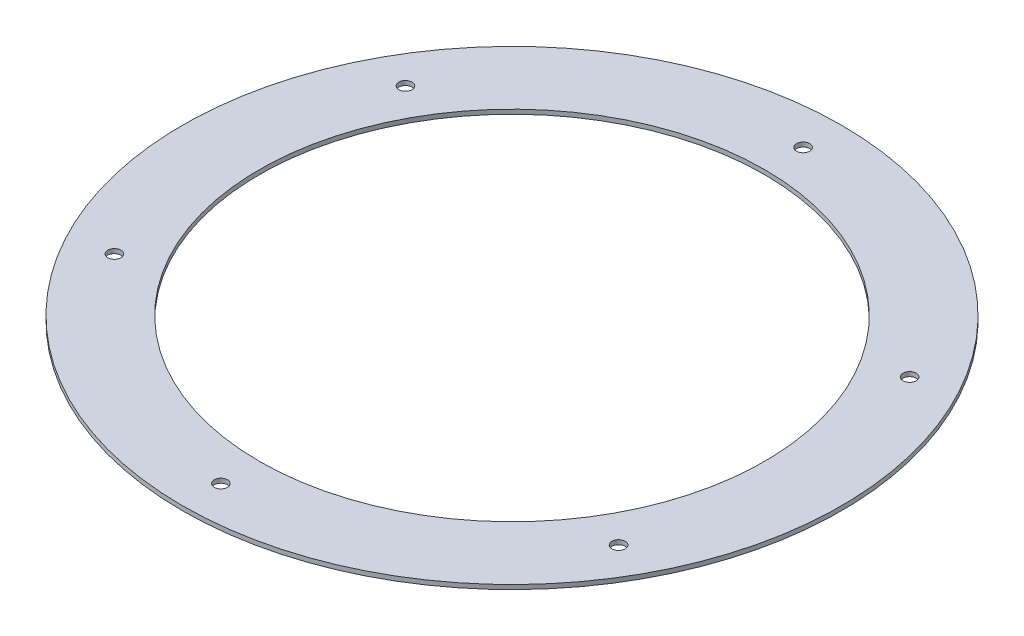
ISO-10303-21;
HEADER;
FILE_DESCRIPTION(('STEP AP214'),'2;1');
FILE_NAME('part.step','',(''),(''),'','','');
FILE_SCHEMA(('AUTOMOTIVE_DESIGN { 1 0 10303 214 1 1 1 1 }'));
ENDSEC;
DATA;
#1=APPLICATION_CONTEXT('core data for automotive mechanical design processes');
#2=APPLICATION_PROTOCOL_DEFINITION('international standard','automotive_design',2000,#1);
#3=PRODUCT_CONTEXT('',#1,'mechanical');
#4=PRODUCT('Part','Part','',(#3));
#5=PRODUCT_RELATED_PRODUCT_CATEGORY('part','',(#4));
#6=PRODUCT_DEFINITION_FORMATION('','',#4);
#7=PRODUCT_DEFINITION_CONTEXT('part definition',#1,'design');
#8=PRODUCT_DEFINITION('design','',#6,#7);
#9=PRODUCT_DEFINITION_SHAPE('','',#8);
#10=(LENGTH_UNIT() NAMED_UNIT(*) SI_UNIT(.MILLI.,.METRE.));
#11=(NAMED_UNIT(*) PLANE_ANGLE_UNIT() SI_UNIT($,.RADIAN.));
#12=(NAMED_UNIT(*) SI_UNIT($,.STERADIAN.) SOLID_ANGLE_UNIT());
#13=UNCERTAINTY_MEASURE_WITH_UNIT(LENGTH_MEASURE(1.E-05),#10,'distance_accuracy_value','');
#14=(GEOMETRIC_REPRESENTATION_CONTEXT(3) GLOBAL_UNCERTAINTY_ASSIGNED_CONTEXT((#13)) GLOBAL_UNIT_ASSIGNED_CONTEXT((#10,
#11,#12)) REPRESENTATION_CONTEXT('',''));
#15=CARTESIAN_POINT('',(0.,0.,0.));
#16=DIRECTION('',(0.,0.,1.));
#17=DIRECTION('',(1.,0.,0.));
#18=AXIS2_PLACEMENT_3D('',#15,#16,#17);
#19=CARTESIAN_POINT('',(0.,2.,0.));
#20=DIRECTION('',(0.,1.,0.));
#21=DIRECTION('',(0.,0.,1.));
#22=AXIS2_PLACEMENT_3D('',#19,#20,#21);
#23=PLANE('',#22);
#24=CARTESIAN_POINT('',(-114.748366001438,2.,66.2500000000001));
#25=DIRECTION('',(0.,1.,0.));
#26=DIRECTION('',(0.,0.,1.));
#27=AXIS2_PLACEMENT_3D('',#24,#25,#26);
#28=CIRCLE('',#27,2.99999999999999);
#29=CARTESIAN_POINT('',(-114.748366001438,2.,69.25));
#30=VERTEX_POINT('',#29);
#31=EDGE_CURVE('E95',#30,#30,#28,.T.);
#32=ORIENTED_EDGE('',*,*,#31,.F.);
#33=EDGE_LOOP('',(#32));
#34=FACE_BOUND('',#33,.T.);
#35=CARTESIAN_POINT('',(114.748366001438,2.,66.25));
#36=DIRECTION('',(0.,1.,0.));
#37=DIRECTION('',(0.,0.,1.));
#38=AXIS2_PLACEMENT_3D('',#35,#36,#37);
#39=CIRCLE('',#38,2.99999999999999);
#40=CARTESIAN_POINT('',(114.748366001438,2.,69.25));
#41=VERTEX_POINT('',#40);
#42=EDGE_CURVE('E79',#41,#41,#39,.T.);
#43=ORIENTED_EDGE('',*,*,#42,.F.);
#44=EDGE_LOOP('',(#43));
#45=FACE_BOUND('',#44,.T.);
#46=CARTESIAN_POINT('',(0.,2.,-132.5));
#47=DIRECTION('',(0.,1.,0.));
#48=DIRECTION('',(0.,0.,1.));
#49=AXIS2_PLACEMENT_3D('',#46,#47,#48);
#50=CIRCLE('',#49,3.);
#51=CARTESIAN_POINT('',(0.,2.,-129.5));
#52=VERTEX_POINT('',#51);
#53=EDGE_CURVE('E63',#52,#52,#50,.T.);
#54=ORIENTED_EDGE('',*,*,#53,.F.);
#55=EDGE_LOOP('',(#54));
#56=FACE_BOUND('',#55,.T.);
#57=CARTESIAN_POINT('',(0.,2.,0.));
#58=DIRECTION('',(0.,1.,0.));
#59=DIRECTION('',(0.,0.,1.));
#60=AXIS2_PLACEMENT_3D('',#57,#58,#59);
#61=CIRCLE('',#60,150.);
#62=CARTESIAN_POINT('',(0.,2.,150.));
#63=VERTEX_POINT('',#62);
#64=EDGE_CURVE('E10',#63,#63,#61,.T.);
#65=ORIENTED_EDGE('',*,*,#64,.T.);
#66=EDGE_LOOP('',(#65));
#67=FACE_BOUND('',#66,.T.);
#68=CARTESIAN_POINT('',(0.,2.,0.));
#69=DIRECTION('',(0.,1.,0.));
#70=DIRECTION('',(0.,0.,1.));
#71=AXIS2_PLACEMENT_3D('',#68,#69,#70);
#72=CIRCLE('',#71,115.);
#73=CARTESIAN_POINT('',(0.,2.,115.));
#74=VERTEX_POINT('',#73);
#75=EDGE_CURVE('E57',#74,#74,#72,.T.);
#76=ORIENTED_EDGE('',*,*,#75,.F.);
#77=EDGE_LOOP('',(#76));
#78=FACE_BOUND('',#77,.T.);
#79=CARTESIAN_POINT('',(114.748366001438,2.,-66.25));
#80=DIRECTION('',(0.,1.,0.));
#81=DIRECTION('',(0.,0.,1.));
#82=AXIS2_PLACEMENT_3D('',#79,#80,#81);
#83=CIRCLE('',#82,3.00000000000001);
#84=CARTESIAN_POINT('',(114.748366001438,2.,-63.25));
#85=VERTEX_POINT('',#84);
#86=EDGE_CURVE('E71',#85,#85,#83,.T.);
#87=ORIENTED_EDGE('',*,*,#86,.F.);
#88=EDGE_LOOP('',(#87));
#89=FACE_BOUND('',#88,.T.);
#90=CARTESIAN_POINT('',(0.,2.,132.5));
#91=DIRECTION('',(0.,1.,0.));
#92=DIRECTION('',(0.,0.,1.));
#93=AXIS2_PLACEMENT_3D('',#90,#91,#92);
#94=CIRCLE('',#93,3.);
#95=CARTESIAN_POINT('',(0.,2.,135.5));
#96=VERTEX_POINT('',#95);
#97=EDGE_CURVE('E87',#96,#96,#94,.T.);
#98=ORIENTED_EDGE('',*,*,#97,.F.);
#99=EDGE_LOOP('',(#98));
#100=FACE_BOUND('',#99,.T.);
#101=CARTESIAN_POINT('',(-114.748366001438,2.,-66.2499999999999));
#102=DIRECTION('',(0.,1.,0.));
#103=DIRECTION('',(0.,0.,1.));
#104=AXIS2_PLACEMENT_3D('',#101,#102,#103);
#105=CIRCLE('',#104,3.00000000000001);
#106=CARTESIAN_POINT('',(-114.748366001438,2.,-63.2499999999999));
#107=VERTEX_POINT('',#106);
#108=EDGE_CURVE('E103',#107,#107,#105,.T.);
#109=ORIENTED_EDGE('',*,*,#108,.F.);
#110=EDGE_LOOP('',(#109));
#111=FACE_BOUND('',#110,.T.);
#112=ADVANCED_FACE('F43',(#34,#45,#56,#67,#78,#89,#100,#111),#23,.T.);
#113=CARTESIAN_POINT('',(0.,0.,0.));
#114=DIRECTION('',(0.,1.,0.));
#115=DIRECTION('',(0.,0.,1.));
#116=AXIS2_PLACEMENT_3D('',#113,#114,#115);
#117=PLANE('',#116);
#118=CARTESIAN_POINT('',(0.,0.,0.));
#119=DIRECTION('',(0.,1.,0.));
#120=DIRECTION('',(0.,0.,1.));
#121=AXIS2_PLACEMENT_3D('',#118,#119,#120);
#122=CIRCLE('',#121,150.);
#123=CARTESIAN_POINT('',(0.,0.,150.));
#124=VERTEX_POINT('',#123);
#125=EDGE_CURVE('E47',#124,#124,#122,.T.);
#126=ORIENTED_EDGE('',*,*,#125,.F.);
#127=EDGE_LOOP('',(#126));
#128=FACE_BOUND('',#127,.T.);
#129=CARTESIAN_POINT('',(0.,0.,0.));
#130=DIRECTION('',(0.,1.,0.));
#131=DIRECTION('',(0.,0.,1.));
#132=AXIS2_PLACEMENT_3D('',#129,#130,#131);
#133=CIRCLE('',#132,115.);
#134=CARTESIAN_POINT('',(0.,0.,115.));
#135=VERTEX_POINT('',#134);
#136=EDGE_CURVE('E59',#135,#135,#133,.T.);
#137=ORIENTED_EDGE('',*,*,#136,.T.);
#138=EDGE_LOOP('',(#137));
#139=FACE_BOUND('',#138,.T.);
#140=CARTESIAN_POINT('',(0.,0.,-132.5));
#141=DIRECTION('',(0.,1.,0.));
#142=DIRECTION('',(0.,0.,1.));
#143=AXIS2_PLACEMENT_3D('',#140,#141,#142);
#144=CIRCLE('',#143,3.);
#145=CARTESIAN_POINT('',(0.,0.,-129.5));
#146=VERTEX_POINT('',#145);
#147=EDGE_CURVE('E67',#146,#146,#144,.T.);
#148=ORIENTED_EDGE('',*,*,#147,.T.);
#149=EDGE_LOOP('',(#148));
#150=FACE_BOUND('',#149,.T.);
#151=CARTESIAN_POINT('',(114.748366001438,0.,-66.25));
#152=DIRECTION('',(0.,1.,0.));
#153=DIRECTION('',(0.,0.,1.));
#154=AXIS2_PLACEMENT_3D('',#151,#152,#153);
#155=CIRCLE('',#154,3.00000000000001);
#156=CARTESIAN_POINT('',(114.748366001438,0.,-63.25));
#157=VERTEX_POINT('',#156);
#158=EDGE_CURVE('E75',#157,#157,#155,.T.);
#159=ORIENTED_EDGE('',*,*,#158,.T.);
#160=EDGE_LOOP('',(#159));
#161=FACE_BOUND('',#160,.T.);
#162=CARTESIAN_POINT('',(114.748366001438,0.,66.25));
#163=DIRECTION('',(0.,1.,0.));
#164=DIRECTION('',(0.,0.,1.));
#165=AXIS2_PLACEMENT_3D('',#162,#163,#164);
#166=CIRCLE('',#165,2.99999999999999);
#167=CARTESIAN_POINT('',(114.748366001438,0.,69.25));
#168=VERTEX_POINT('',#167);
#169=EDGE_CURVE('E83',#168,#168,#166,.T.);
#170=ORIENTED_EDGE('',*,*,#169,.T.);
#171=EDGE_LOOP('',(#170));
#172=FACE_BOUND('',#171,.T.);
#173=CARTESIAN_POINT('',(0.,0.,132.5));
#174=DIRECTION('',(0.,1.,0.));
#175=DIRECTION('',(0.,0.,1.));
#176=AXIS2_PLACEMENT_3D('',#173,#174,#175);
#177=CIRCLE('',#176,3.);
#178=CARTESIAN_POINT('',(0.,0.,135.5));
#179=VERTEX_POINT('',#178);
#180=EDGE_CURVE('E91',#179,#179,#177,.T.);
#181=ORIENTED_EDGE('',*,*,#180,.T.);
#182=EDGE_LOOP('',(#181));
#183=FACE_BOUND('',#182,.T.);
#184=CARTESIAN_POINT('',(-114.748366001438,0.,66.2500000000001));
#185=DIRECTION('',(0.,1.,0.));
#186=DIRECTION('',(0.,0.,1.));
#187=AXIS2_PLACEMENT_3D('',#184,#185,#186);
#188=CIRCLE('',#187,2.99999999999999);
#189=CARTESIAN_POINT('',(-114.748366001438,0.,69.25));
#190=VERTEX_POINT('',#189);
#191=EDGE_CURVE('E99',#190,#190,#188,.T.);
#192=ORIENTED_EDGE('',*,*,#191,.T.);
#193=EDGE_LOOP('',(#192));
#194=FACE_BOUND('',#193,.T.);
#195=CARTESIAN_POINT('',(-114.748366001438,0.,-66.2499999999999));
#196=DIRECTION('',(0.,1.,0.));
#197=DIRECTION('',(0.,0.,1.));
#198=AXIS2_PLACEMENT_3D('',#195,#196,#197);
#199=CIRCLE('',#198,3.00000000000001);
#200=CARTESIAN_POINT('',(-114.748366001438,0.,-63.2499999999999));
#201=VERTEX_POINT('',#200);
#202=EDGE_CURVE('E106',#201,#201,#199,.T.);
#203=ORIENTED_EDGE('',*,*,#202,.T.);
#204=EDGE_LOOP('',(#203));
#205=FACE_BOUND('',#204,.T.);
#206=ADVANCED_FACE('F118',(#128,#139,#150,#161,#172,#183,#194,#205),#117,.F.);
#207=CARTESIAN_POINT('',(0.,2.,0.));
#208=DIRECTION('',(0.,-1.,0.));
#209=DIRECTION('',(0.,0.,-1.));
#210=AXIS2_PLACEMENT_3D('',#207,#208,#209);
#211=CYLINDRICAL_SURFACE('',#210,150.);
#212=ORIENTED_EDGE('',*,*,#64,.F.);
#213=EDGE_LOOP('',(#212));
#214=FACE_BOUND('',#213,.T.);
#215=ORIENTED_EDGE('',*,*,#125,.T.);
#216=EDGE_LOOP('',(#215));
#217=FACE_BOUND('',#216,.T.);
#218=ADVANCED_FACE('F45',(#214,#217),#211,.T.);
#219=CARTESIAN_POINT('',(0.,2.,0.));
#220=DIRECTION('',(0.,-1.,0.));
#221=DIRECTION('',(0.,0.,-1.));
#222=AXIS2_PLACEMENT_3D('',#219,#220,#221);
#223=CYLINDRICAL_SURFACE('',#222,115.);
#224=ORIENTED_EDGE('',*,*,#75,.T.);
#225=EDGE_LOOP('',(#224));
#226=FACE_BOUND('',#225,.T.);
#227=ORIENTED_EDGE('',*,*,#136,.F.);
#228=EDGE_LOOP('',(#227));
#229=FACE_BOUND('',#228,.T.);
#230=ADVANCED_FACE('F128',(#226,#229),#223,.F.);
#231=CARTESIAN_POINT('',(0.,2.,-132.5));
#232=DIRECTION('',(0.,-1.,0.));
#233=DIRECTION('',(0.,0.,-1.));
#234=AXIS2_PLACEMENT_3D('',#231,#232,#233);
#235=CYLINDRICAL_SURFACE('',#234,3.);
#236=ORIENTED_EDGE('',*,*,#53,.T.);
#237=EDGE_LOOP('',(#236));
#238=FACE_BOUND('',#237,.T.);
#239=ORIENTED_EDGE('',*,*,#147,.F.);
#240=EDGE_LOOP('',(#239));
#241=FACE_BOUND('',#240,.T.);
#242=ADVANCED_FACE('F131',(#238,#241),#235,.F.);
#243=CARTESIAN_POINT('',(114.748366001438,2.,-66.25));
#244=DIRECTION('',(0.,-1.,0.));
#245=DIRECTION('',(0.,0.,-1.));
#246=AXIS2_PLACEMENT_3D('',#243,#244,#245);
#247=CYLINDRICAL_SURFACE('',#246,3.00000000000001);
#248=ORIENTED_EDGE('',*,*,#86,.T.);
#249=EDGE_LOOP('',(#248));
#250=FACE_BOUND('',#249,.T.);
#251=ORIENTED_EDGE('',*,*,#158,.F.);
#252=EDGE_LOOP('',(#251));
#253=FACE_BOUND('',#252,.T.);
#254=ADVANCED_FACE('F135',(#250,#253),#247,.F.);
#255=CARTESIAN_POINT('',(114.748366001438,2.,66.25));
#256=DIRECTION('',(0.,-1.,0.));
#257=DIRECTION('',(0.,0.,-1.));
#258=AXIS2_PLACEMENT_3D('',#255,#256,#257);
#259=CYLINDRICAL_SURFACE('',#258,2.99999999999999);
#260=ORIENTED_EDGE('',*,*,#42,.T.);
#261=EDGE_LOOP('',(#260));
#262=FACE_BOUND('',#261,.T.);
#263=ORIENTED_EDGE('',*,*,#169,.F.);
#264=EDGE_LOOP('',(#263));
#265=FACE_BOUND('',#264,.T.);
#266=ADVANCED_FACE('F139',(#262,#265),#259,.F.);
#267=CARTESIAN_POINT('',(0.,2.,132.5));
#268=DIRECTION('',(0.,-1.,0.));
#269=DIRECTION('',(0.,0.,-1.));
#270=AXIS2_PLACEMENT_3D('',#267,#268,#269);
#271=CYLINDRICAL_SURFACE('',#270,3.);
#272=ORIENTED_EDGE('',*,*,#97,.T.);
#273=EDGE_LOOP('',(#272));
#274=FACE_BOUND('',#273,.T.);
#275=ORIENTED_EDGE('',*,*,#180,.F.);
#276=EDGE_LOOP('',(#275));
#277=FACE_BOUND('',#276,.T.);
#278=ADVANCED_FACE('F143',(#274,#277),#271,.F.);
#279=CARTESIAN_POINT('',(-114.748366001438,2.,66.2500000000001));
#280=DIRECTION('',(0.,-1.,0.));
#281=DIRECTION('',(0.,0.,-1.));
#282=AXIS2_PLACEMENT_3D('',#279,#280,#281);
#283=CYLINDRICAL_SURFACE('',#282,2.99999999999999);
#284=ORIENTED_EDGE('',*,*,#31,.T.);
#285=EDGE_LOOP('',(#284));
#286=FACE_BOUND('',#285,.T.);
#287=ORIENTED_EDGE('',*,*,#191,.F.);
#288=EDGE_LOOP('',(#287));
#289=FACE_BOUND('',#288,.T.);
#290=ADVANCED_FACE('F147',(#286,#289),#283,.F.);
#291=CARTESIAN_POINT('',(-114.748366001438,2.,-66.2499999999999));
#292=DIRECTION('',(0.,-1.,0.));
#293=DIRECTION('',(0.,0.,-1.));
#294=AXIS2_PLACEMENT_3D('',#291,#292,#293);
#295=CYLINDRICAL_SURFACE('',#294,3.00000000000001);
#296=ORIENTED_EDGE('',*,*,#108,.T.);
#297=EDGE_LOOP('',(#296));
#298=FACE_BOUND('',#297,.T.);
#299=ORIENTED_EDGE('',*,*,#202,.F.);
#300=EDGE_LOOP('',(#299));
#301=FACE_BOUND('',#300,.T.);
#302=ADVANCED_FACE('F114',(#298,#301),#295,.F.);
#303=CLOSED_SHELL('',(#112,#206,#218,#230,#242,#254,#266,#278,#290,#302));
#304=MANIFOLD_SOLID_BREP('B2',#303);
#305=ADVANCED_BREP_SHAPE_REPRESENTATION('',(#18,#304),#14);
#306=SHAPE_DEFINITION_REPRESENTATION(#9,#305);
ENDSEC;
END-ISO-10303-21;
